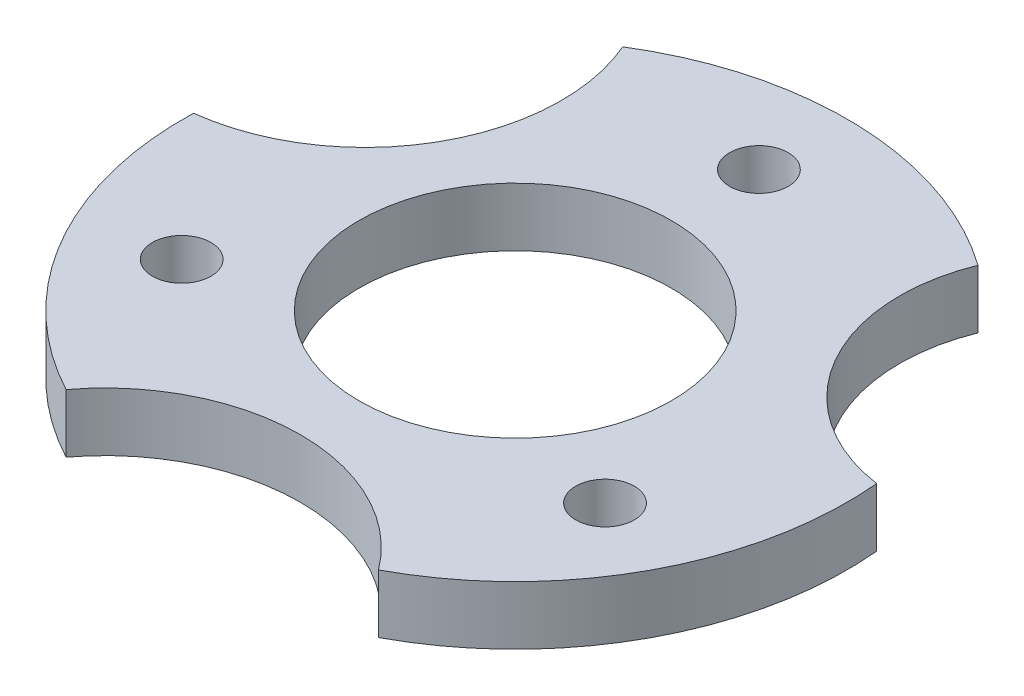
ISO-10303-21;
HEADER;
FILE_DESCRIPTION(('STEP AP214'),'2;1');
FILE_NAME('part.step','',(''),(''),'','','');
FILE_SCHEMA(('AUTOMOTIVE_DESIGN { 1 0 10303 214 1 1 1 1 }'));
ENDSEC;
DATA;
#1=APPLICATION_CONTEXT('core data for automotive mechanical design processes');
#2=APPLICATION_PROTOCOL_DEFINITION('international standard','automotive_design',2000,#1);
#3=PRODUCT_CONTEXT('',#1,'mechanical');
#4=PRODUCT('Part','Part','',(#3));
#5=PRODUCT_RELATED_PRODUCT_CATEGORY('part','',(#4));
#6=PRODUCT_DEFINITION_FORMATION('','',#4);
#7=PRODUCT_DEFINITION_CONTEXT('part definition',#1,'design');
#8=PRODUCT_DEFINITION('design','',#6,#7);
#9=PRODUCT_DEFINITION_SHAPE('','',#8);
#10=(LENGTH_UNIT() NAMED_UNIT(*) SI_UNIT(.MILLI.,.METRE.));
#11=(NAMED_UNIT(*) PLANE_ANGLE_UNIT() SI_UNIT($,.RADIAN.));
#12=(NAMED_UNIT(*) SI_UNIT($,.STERADIAN.) SOLID_ANGLE_UNIT());
#13=UNCERTAINTY_MEASURE_WITH_UNIT(LENGTH_MEASURE(1.E-05),#10,'distance_accuracy_value','');
#14=(GEOMETRIC_REPRESENTATION_CONTEXT(3) GLOBAL_UNCERTAINTY_ASSIGNED_CONTEXT((#13)) GLOBAL_UNIT_ASSIGNED_CONTEXT((#10,
#11,#12)) REPRESENTATION_CONTEXT('',''));
#15=CARTESIAN_POINT('',(0.,0.,0.));
#16=DIRECTION('',(0.,0.,1.));
#17=DIRECTION('',(1.,0.,0.));
#18=AXIS2_PLACEMENT_3D('',#15,#16,#17);
#19=CARTESIAN_POINT('',(0.,-83.,0.));
#20=DIRECTION('',(0.,1.,0.));
#21=DIRECTION('',(0.,0.,-1.));
#22=AXIS2_PLACEMENT_3D('',#19,#20,#21);
#23=CYLINDRICAL_SURFACE('',#22,17.);
#24=DIRECTION('',(0.,1.,0.));
#25=VECTOR('',#24,1.);
#26=CARTESIAN_POINT('',(9.83871252169302,-80.,-13.8636119361255));
#27=LINE('',#26,#25);
#28=CARTESIAN_POINT('',(9.83871252169302,-83.,-13.8636119361255));
#29=VERTEX_POINT('',#28);
#30=CARTESIAN_POINT('',(9.83871252169302,-80.,-13.8636119361255));
#31=VERTEX_POINT('',#30);
#32=EDGE_CURVE('E11',#29,#31,#27,.T.);
#33=ORIENTED_EDGE('',*,*,#32,.F.);
#34=CARTESIAN_POINT('',(0.,-83.,0.));
#35=DIRECTION('',(0.,-1.,0.));
#36=DIRECTION('',(0.,0.,1.));
#37=AXIS2_PLACEMENT_3D('',#34,#35,#36);
#38=CIRCLE('',#37,17.);
#39=CARTESIAN_POINT('',(-8.94741257322652,-83.,-14.454888731653));
#40=VERTEX_POINT('',#39);
#41=EDGE_CURVE('E107',#40,#29,#38,.T.);
#42=ORIENTED_EDGE('',*,*,#41,.F.);
#43=DIRECTION('',(0.,1.,0.));
#44=VECTOR('',#43,1.);
#45=CARTESIAN_POINT('',(-8.94741257322652,-83.,-14.454888731653));
#46=LINE('',#45,#44);
#47=CARTESIAN_POINT('',(-8.94741257322652,-80.,-14.454888731653));
#48=VERTEX_POINT('',#47);
#49=EDGE_CURVE('E133',#40,#48,#46,.T.);
#50=ORIENTED_EDGE('',*,*,#49,.T.);
#51=CARTESIAN_POINT('',(0.,-80.,0.));
#52=DIRECTION('',(0.,-1.,0.));
#53=DIRECTION('',(0.,0.,1.));
#54=AXIS2_PLACEMENT_3D('',#51,#52,#53);
#55=CIRCLE('',#54,17.);
#56=EDGE_CURVE('E127',#48,#31,#55,.T.);
#57=ORIENTED_EDGE('',*,*,#56,.T.);
#58=EDGE_LOOP('',(#33,#42,#50,#57));
#59=FACE_BOUND('',#58,.T.);
#60=ADVANCED_FACE('F34',(#59),#23,.T.);
#61=DIRECTION('',(0.,1.,0.));
#62=VECTOR('',#61,1.);
#63=CARTESIAN_POINT('',(16.9255963857403,-80.,-1.58876901625547));
#64=LINE('',#63,#62);
#65=CARTESIAN_POINT('',(16.9255963857403,-80.,-1.58876901625547));
#66=VERTEX_POINT('',#65);
#67=CARTESIAN_POINT('',(16.9255963857403,-83.,-1.58876901625547));
#68=VERTEX_POINT('',#67);
#69=EDGE_CURVE('E42',#66,#68,#64,.F.);
#70=ORIENTED_EDGE('',*,*,#69,.F.);
#71=CARTESIAN_POINT('',(8.,-80.,15.));
#72=VERTEX_POINT('',#71);
#73=EDGE_CURVE('E126',#66,#72,#55,.T.);
#74=ORIENTED_EDGE('',*,*,#73,.T.);
#75=DIRECTION('',(0.,1.,0.));
#76=VECTOR('',#75,1.);
#77=CARTESIAN_POINT('',(8.,-83.,15.));
#78=LINE('',#77,#76);
#79=CARTESIAN_POINT('',(8.,-83.,15.));
#80=VERTEX_POINT('',#79);
#81=EDGE_CURVE('E111',#80,#72,#78,.T.);
#82=ORIENTED_EDGE('',*,*,#81,.F.);
#83=EDGE_CURVE('E104',#68,#80,#38,.T.);
#84=ORIENTED_EDGE('',*,*,#83,.F.);
#85=EDGE_LOOP('',(#70,#74,#82,#84));
#86=FACE_BOUND('',#85,.T.);
#87=ADVANCED_FACE('F110',(#86),#23,.T.);
#88=CARTESIAN_POINT('',(-9.09326673973659,-83.,-5.25));
#89=DIRECTION('',(0.,-1.,0.));
#90=DIRECTION('',(0.,0.,1.));
#91=AXIS2_PLACEMENT_3D('',#88,#89,#90);
#92=PLANE('',#91);
#93=CARTESIAN_POINT('',(10.8346034898601,-83.,6.23388861125312));
#94=DIRECTION('',(0.,-1.,0.));
#95=DIRECTION('',(0.,0.,1.));
#96=AXIS2_PLACEMENT_3D('',#93,#94,#95);
#97=CIRCLE('',#96,1.5);
#98=CARTESIAN_POINT('',(10.8346034898601,-83.,7.73388861125312));
#99=VERTEX_POINT('',#98);
#100=EDGE_CURVE('E256',#99,#99,#97,.T.);
#101=ORIENTED_EDGE('',*,*,#100,.F.);
#102=EDGE_LOOP('',(#101));
#103=FACE_BOUND('',#102,.T.);
#104=CARTESIAN_POINT('',(0.,-83.,0.));
#105=DIRECTION('',(0.,-1.,0.));
#106=DIRECTION('',(0.,0.,1.));
#107=AXIS2_PLACEMENT_3D('',#104,#105,#106);
#108=CIRCLE('',#107,8.);
#109=CARTESIAN_POINT('',(0.,-83.,8.));
#110=VERTEX_POINT('',#109);
#111=EDGE_CURVE('E124',#110,#110,#108,.T.);
#112=ORIENTED_EDGE('',*,*,#111,.F.);
#113=EDGE_LOOP('',(#112));
#114=FACE_BOUND('',#113,.T.);
#115=ORIENTED_EDGE('',*,*,#41,.T.);
#116=CARTESIAN_POINT('',(18.1865334794732,-83.,-10.5));
#117=DIRECTION('',(0.,-1.,0.));
#118=DIRECTION('',(0.,0.,1.));
#119=AXIS2_PLACEMENT_3D('',#116,#117,#118);
#120=CIRCLE('',#119,9.);
#121=EDGE_CURVE('E95',#29,#68,#120,.F.);
#122=ORIENTED_EDGE('',*,*,#121,.T.);
#123=ORIENTED_EDGE('',*,*,#83,.T.);
#124=CARTESIAN_POINT('',(0.,-83.,21.));
#125=DIRECTION('',(0.,1.,0.));
#126=DIRECTION('',(0.,0.,1.));
#127=AXIS2_PLACEMENT_3D('',#124,#125,#126);
#128=CIRCLE('',#127,10.);
#129=CARTESIAN_POINT('',(-8.,-83.,15.));
#130=VERTEX_POINT('',#129);
#131=EDGE_CURVE('E57',#80,#130,#128,.T.);
#132=ORIENTED_EDGE('',*,*,#131,.T.);
#133=CARTESIAN_POINT('',(0.,-83.,0.));
#134=DIRECTION('',(0.,-1.,0.));
#135=DIRECTION('',(0.,0.,1.));
#136=AXIS2_PLACEMENT_3D('',#133,#134,#135);
#137=CIRCLE('',#136,17.);
#138=CARTESIAN_POINT('',(-16.9920071371021,-83.,-0.521242220727994));
#139=VERTEX_POINT('',#138);
#140=EDGE_CURVE('E113',#130,#139,#137,.T.);
#141=ORIENTED_EDGE('',*,*,#140,.T.);
#142=CARTESIAN_POINT('',(-18.1865334794732,-83.,-10.5));
#143=DIRECTION('',(0.,1.,0.));
#144=DIRECTION('',(0.,0.,1.));
#145=AXIS2_PLACEMENT_3D('',#142,#143,#144);
#146=CIRCLE('',#145,10.05);
#147=EDGE_CURVE('E86',#139,#40,#146,.T.);
#148=ORIENTED_EDGE('',*,*,#147,.T.);
#149=EDGE_LOOP('',(#115,#122,#123,#132,#141,#148));
#150=FACE_BOUND('',#149,.T.);
#151=CARTESIAN_POINT('',(-10.8160076466377,-83.,6.26609755652382));
#152=DIRECTION('',(0.,-1.,0.));
#153=DIRECTION('',(0.,0.,1.));
#154=AXIS2_PLACEMENT_3D('',#151,#152,#153);
#155=CIRCLE('',#154,1.5);
#156=CARTESIAN_POINT('',(-10.8160076466377,-83.,7.76609755652382));
#157=VERTEX_POINT('',#156);
#158=EDGE_CURVE('E246',#157,#157,#155,.T.);
#159=ORIENTED_EDGE('',*,*,#158,.F.);
#160=EDGE_LOOP('',(#159));
#161=FACE_BOUND('',#160,.T.);
#162=CARTESIAN_POINT('',(-0.018595843222347,-83.,-12.4999861677769));
#163=DIRECTION('',(0.,-1.,0.));
#164=DIRECTION('',(0.,0.,1.));
#165=AXIS2_PLACEMENT_3D('',#162,#163,#164);
#166=CIRCLE('',#165,1.5);
#167=CARTESIAN_POINT('',(-0.0185958432223473,-83.,-10.9999861677769));
#168=VERTEX_POINT('',#167);
#169=EDGE_CURVE('E257',#168,#168,#166,.T.);
#170=ORIENTED_EDGE('',*,*,#169,.F.);
#171=EDGE_LOOP('',(#170));
#172=FACE_BOUND('',#171,.T.);
#173=ADVANCED_FACE('F102',(#103,#114,#150,#161,#172),#92,.T.);
#174=CARTESIAN_POINT('',(-9.09326673973659,-80.,-5.25));
#175=DIRECTION('',(0.,-1.,0.));
#176=DIRECTION('',(0.,0.,1.));
#177=AXIS2_PLACEMENT_3D('',#174,#175,#176);
#178=PLANE('',#177);
#179=CARTESIAN_POINT('',(18.1865334794732,-80.,-10.5));
#180=DIRECTION('',(0.,-1.,0.));
#181=DIRECTION('',(0.,0.,1.));
#182=AXIS2_PLACEMENT_3D('',#179,#180,#181);
#183=CIRCLE('',#182,9.);
#184=EDGE_CURVE('E48',#31,#66,#183,.F.);
#185=ORIENTED_EDGE('',*,*,#184,.F.);
#186=ORIENTED_EDGE('',*,*,#56,.F.);
#187=CARTESIAN_POINT('',(-18.1865334794732,-80.,-10.5));
#188=DIRECTION('',(0.,1.,0.));
#189=DIRECTION('',(0.,0.,1.));
#190=AXIS2_PLACEMENT_3D('',#187,#188,#189);
#191=CIRCLE('',#190,10.05);
#192=CARTESIAN_POINT('',(-16.9920071371021,-80.,-0.521242220727994));
#193=VERTEX_POINT('',#192);
#194=EDGE_CURVE('E123',#193,#48,#191,.T.);
#195=ORIENTED_EDGE('',*,*,#194,.F.);
#196=CARTESIAN_POINT('',(0.,-80.,0.));
#197=DIRECTION('',(0.,-1.,0.));
#198=DIRECTION('',(0.,0.,1.));
#199=AXIS2_PLACEMENT_3D('',#196,#197,#198);
#200=CIRCLE('',#199,17.);
#201=CARTESIAN_POINT('',(-8.,-80.,15.));
#202=VERTEX_POINT('',#201);
#203=EDGE_CURVE('E120',#202,#193,#200,.T.);
#204=ORIENTED_EDGE('',*,*,#203,.F.);
#205=CARTESIAN_POINT('',(0.,-80.,21.));
#206=DIRECTION('',(0.,1.,0.));
#207=DIRECTION('',(0.,0.,1.));
#208=AXIS2_PLACEMENT_3D('',#205,#206,#207);
#209=CIRCLE('',#208,10.);
#210=EDGE_CURVE('E78',#72,#202,#209,.T.);
#211=ORIENTED_EDGE('',*,*,#210,.F.);
#212=ORIENTED_EDGE('',*,*,#73,.F.);
#213=EDGE_LOOP('',(#185,#186,#195,#204,#211,#212));
#214=FACE_BOUND('',#213,.T.);
#215=CARTESIAN_POINT('',(0.,-80.,0.));
#216=DIRECTION('',(0.,-1.,0.));
#217=DIRECTION('',(0.,0.,1.));
#218=AXIS2_PLACEMENT_3D('',#215,#216,#217);
#219=CIRCLE('',#218,8.);
#220=CARTESIAN_POINT('',(0.,-80.,8.));
#221=VERTEX_POINT('',#220);
#222=EDGE_CURVE('E250',#221,#221,#219,.T.);
#223=ORIENTED_EDGE('',*,*,#222,.T.);
#224=EDGE_LOOP('',(#223));
#225=FACE_BOUND('',#224,.T.);
#226=CARTESIAN_POINT('',(-10.8160076466377,-80.,6.26609755652382));
#227=DIRECTION('',(0.,-1.,0.));
#228=DIRECTION('',(0.,0.,1.));
#229=AXIS2_PLACEMENT_3D('',#226,#227,#228);
#230=CIRCLE('',#229,1.5);
#231=CARTESIAN_POINT('',(-10.8160076466377,-80.,7.76609755652382));
#232=VERTEX_POINT('',#231);
#233=EDGE_CURVE('E251',#232,#232,#230,.T.);
#234=ORIENTED_EDGE('',*,*,#233,.T.);
#235=EDGE_LOOP('',(#234));
#236=FACE_BOUND('',#235,.T.);
#237=CARTESIAN_POINT('',(10.8346034898601,-80.,6.23388861125312));
#238=DIRECTION('',(0.,-1.,0.));
#239=DIRECTION('',(0.,0.,1.));
#240=AXIS2_PLACEMENT_3D('',#237,#238,#239);
#241=CIRCLE('',#240,1.5);
#242=CARTESIAN_POINT('',(10.8346034898601,-80.,7.73388861125312));
#243=VERTEX_POINT('',#242);
#244=EDGE_CURVE('E253',#243,#243,#241,.T.);
#245=ORIENTED_EDGE('',*,*,#244,.T.);
#246=EDGE_LOOP('',(#245));
#247=FACE_BOUND('',#246,.T.);
#248=CARTESIAN_POINT('',(-0.018595843222347,-80.,-12.4999861677769));
#249=DIRECTION('',(0.,-1.,0.));
#250=DIRECTION('',(0.,0.,1.));
#251=AXIS2_PLACEMENT_3D('',#248,#249,#250);
#252=CIRCLE('',#251,1.5);
#253=CARTESIAN_POINT('',(-0.0185958432223473,-80.,-10.9999861677769));
#254=VERTEX_POINT('',#253);
#255=EDGE_CURVE('E108',#254,#254,#252,.T.);
#256=ORIENTED_EDGE('',*,*,#255,.T.);
#257=EDGE_LOOP('',(#256));
#258=FACE_BOUND('',#257,.T.);
#259=ADVANCED_FACE('F142',(#214,#225,#236,#247,#258),#178,.F.);
#260=CARTESIAN_POINT('',(0.,-83.,0.));
#261=DIRECTION('',(0.,1.,0.));
#262=DIRECTION('',(0.,0.,-1.));
#263=AXIS2_PLACEMENT_3D('',#260,#261,#262);
#264=CYLINDRICAL_SURFACE('',#263,17.);
#265=ORIENTED_EDGE('',*,*,#203,.T.);
#266=DIRECTION('',(0.,1.,0.));
#267=VECTOR('',#266,1.);
#268=CARTESIAN_POINT('',(-16.9920071371021,-83.,-0.521242220727994));
#269=LINE('',#268,#267);
#270=EDGE_CURVE('E100',#139,#193,#269,.T.);
#271=ORIENTED_EDGE('',*,*,#270,.F.);
#272=ORIENTED_EDGE('',*,*,#140,.F.);
#273=DIRECTION('',(0.,1.,0.));
#274=VECTOR('',#273,1.);
#275=CARTESIAN_POINT('',(-8.,-83.,15.));
#276=LINE('',#275,#274);
#277=EDGE_CURVE('E119',#130,#202,#276,.T.);
#278=ORIENTED_EDGE('',*,*,#277,.T.);
#279=EDGE_LOOP('',(#265,#271,#272,#278));
#280=FACE_BOUND('',#279,.T.);
#281=ADVANCED_FACE('F36',(#280),#264,.T.);
#282=CARTESIAN_POINT('',(-18.1865334794732,-83.,-10.5));
#283=DIRECTION('',(0.,1.,0.));
#284=DIRECTION('',(0.,0.,-1.));
#285=AXIS2_PLACEMENT_3D('',#282,#283,#284);
#286=CYLINDRICAL_SURFACE('',#285,10.05);
#287=ORIENTED_EDGE('',*,*,#194,.T.);
#288=ORIENTED_EDGE('',*,*,#49,.F.);
#289=ORIENTED_EDGE('',*,*,#147,.F.);
#290=ORIENTED_EDGE('',*,*,#270,.T.);
#291=EDGE_LOOP('',(#287,#288,#289,#290));
#292=FACE_BOUND('',#291,.T.);
#293=ADVANCED_FACE('F137',(#292),#286,.F.);
#294=CARTESIAN_POINT('',(0.,-83.,21.));
#295=DIRECTION('',(0.,1.,0.));
#296=DIRECTION('',(0.,0.,-1.));
#297=AXIS2_PLACEMENT_3D('',#294,#295,#296);
#298=CYLINDRICAL_SURFACE('',#297,10.);
#299=ORIENTED_EDGE('',*,*,#210,.T.);
#300=ORIENTED_EDGE('',*,*,#277,.F.);
#301=ORIENTED_EDGE('',*,*,#131,.F.);
#302=ORIENTED_EDGE('',*,*,#81,.T.);
#303=EDGE_LOOP('',(#299,#300,#301,#302));
#304=FACE_BOUND('',#303,.T.);
#305=ADVANCED_FACE('F153',(#304),#298,.F.);
#306=CARTESIAN_POINT('',(0.,-83.,0.));
#307=DIRECTION('',(0.,1.,0.));
#308=DIRECTION('',(0.,0.,-1.));
#309=AXIS2_PLACEMENT_3D('',#306,#307,#308);
#310=CYLINDRICAL_SURFACE('',#309,8.);
#311=ORIENTED_EDGE('',*,*,#111,.T.);
#312=EDGE_LOOP('',(#311));
#313=FACE_BOUND('',#312,.T.);
#314=ORIENTED_EDGE('',*,*,#222,.F.);
#315=EDGE_LOOP('',(#314));
#316=FACE_BOUND('',#315,.T.);
#317=ADVANCED_FACE('F161',(#313,#316),#310,.F.);
#318=CARTESIAN_POINT('',(-10.8160076466377,-83.,6.26609755652382));
#319=DIRECTION('',(0.,1.,0.));
#320=DIRECTION('',(0.,0.,-1.));
#321=AXIS2_PLACEMENT_3D('',#318,#319,#320);
#322=CYLINDRICAL_SURFACE('',#321,1.5);
#323=ORIENTED_EDGE('',*,*,#158,.T.);
#324=EDGE_LOOP('',(#323));
#325=FACE_BOUND('',#324,.T.);
#326=ORIENTED_EDGE('',*,*,#233,.F.);
#327=EDGE_LOOP('',(#326));
#328=FACE_BOUND('',#327,.T.);
#329=ADVANCED_FACE('F175',(#325,#328),#322,.F.);
#330=CARTESIAN_POINT('',(10.8346034898601,-83.,6.23388861125312));
#331=DIRECTION('',(0.,1.,0.));
#332=DIRECTION('',(0.,0.,-1.));
#333=AXIS2_PLACEMENT_3D('',#330,#331,#332);
#334=CYLINDRICAL_SURFACE('',#333,1.5);
#335=ORIENTED_EDGE('',*,*,#100,.T.);
#336=EDGE_LOOP('',(#335));
#337=FACE_BOUND('',#336,.T.);
#338=ORIENTED_EDGE('',*,*,#244,.F.);
#339=EDGE_LOOP('',(#338));
#340=FACE_BOUND('',#339,.T.);
#341=ADVANCED_FACE('F179',(#337,#340),#334,.F.);
#342=CARTESIAN_POINT('',(-0.018595843222347,-83.,-12.4999861677769));
#343=DIRECTION('',(0.,1.,0.));
#344=DIRECTION('',(0.,0.,-1.));
#345=AXIS2_PLACEMENT_3D('',#342,#343,#344);
#346=CYLINDRICAL_SURFACE('',#345,1.5);
#347=ORIENTED_EDGE('',*,*,#169,.T.);
#348=EDGE_LOOP('',(#347));
#349=FACE_BOUND('',#348,.T.);
#350=ORIENTED_EDGE('',*,*,#255,.F.);
#351=EDGE_LOOP('',(#350));
#352=FACE_BOUND('',#351,.T.);
#353=ADVANCED_FACE('F183',(#349,#352),#346,.F.);
#354=CARTESIAN_POINT('',(18.1865334794732,-86.,-10.5));
#355=DIRECTION('',(0.,1.,0.));
#356=DIRECTION('',(0.,0.,-1.));
#357=AXIS2_PLACEMENT_3D('',#354,#355,#356);
#358=CYLINDRICAL_SURFACE('',#357,9.);
#359=ORIENTED_EDGE('',*,*,#32,.T.);
#360=ORIENTED_EDGE('',*,*,#184,.T.);
#361=ORIENTED_EDGE('',*,*,#69,.T.);
#362=ORIENTED_EDGE('',*,*,#121,.F.);
#363=EDGE_LOOP('',(#359,#360,#361,#362));
#364=FACE_BOUND('',#363,.T.);
#365=ADVANCED_FACE('F94',(#364),#358,.F.);
#366=CLOSED_SHELL('',(#60,#87,#173,#259,#281,#293,#305,#317,#329,#341,#353,#365));
#367=MANIFOLD_SOLID_BREP('B2',#366);
#368=ADVANCED_BREP_SHAPE_REPRESENTATION('',(#18,#367),#14);
#369=SHAPE_DEFINITION_REPRESENTATION(#9,#368);
ENDSEC;
END-ISO-10303-21;
